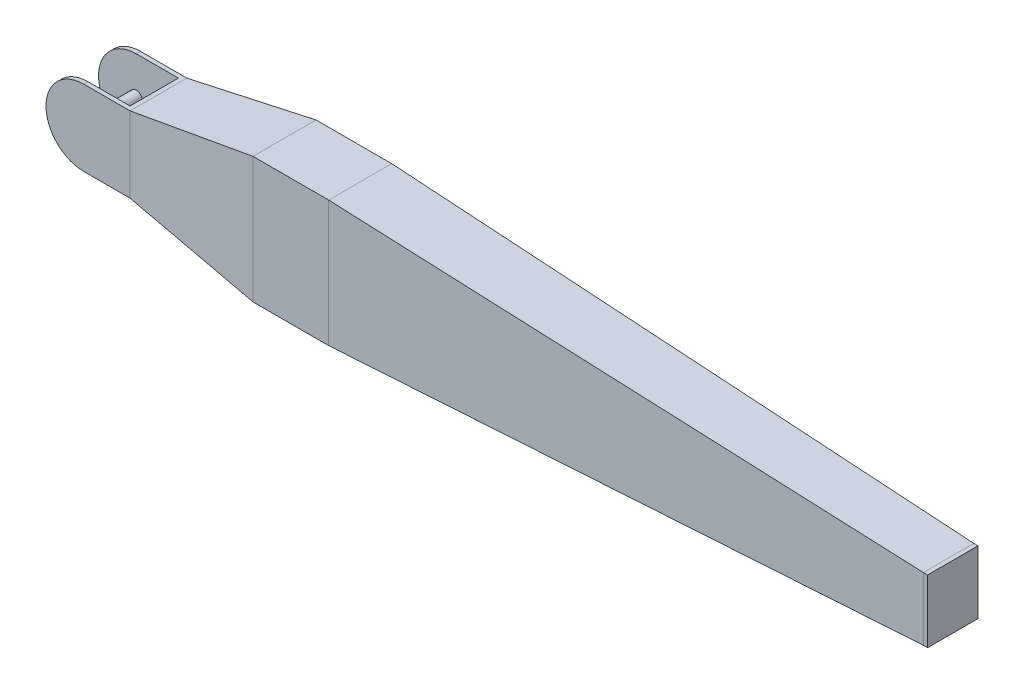
ISO-10303-21;
HEADER;
FILE_DESCRIPTION(('STEP AP214'),'2;1');
FILE_NAME('part.step','',(''),(''),'','','');
FILE_SCHEMA(('AUTOMOTIVE_DESIGN { 1 0 10303 214 1 1 1 1 }'));
ENDSEC;
DATA;
#1=APPLICATION_CONTEXT('core data for automotive mechanical design processes');
#2=APPLICATION_PROTOCOL_DEFINITION('international standard','automotive_design',2000,#1);
#3=PRODUCT_CONTEXT('',#1,'mechanical');
#4=PRODUCT('Part','Part','',(#3));
#5=PRODUCT_RELATED_PRODUCT_CATEGORY('part','',(#4));
#6=PRODUCT_DEFINITION_FORMATION('','',#4);
#7=PRODUCT_DEFINITION_CONTEXT('part definition',#1,'design');
#8=PRODUCT_DEFINITION('design','',#6,#7);
#9=PRODUCT_DEFINITION_SHAPE('','',#8);
#10=(LENGTH_UNIT() NAMED_UNIT(*) SI_UNIT(.MILLI.,.METRE.));
#11=(NAMED_UNIT(*) PLANE_ANGLE_UNIT() SI_UNIT($,.RADIAN.));
#12=(NAMED_UNIT(*) SI_UNIT($,.STERADIAN.) SOLID_ANGLE_UNIT());
#13=UNCERTAINTY_MEASURE_WITH_UNIT(LENGTH_MEASURE(1.E-05),#10,'distance_accuracy_value','');
#14=(GEOMETRIC_REPRESENTATION_CONTEXT(3) GLOBAL_UNCERTAINTY_ASSIGNED_CONTEXT((#13)) GLOBAL_UNIT_ASSIGNED_CONTEXT((#10,
#11,#12)) REPRESENTATION_CONTEXT('',''));
#15=CARTESIAN_POINT('',(0.,0.,0.));
#16=DIRECTION('',(0.,0.,1.));
#17=DIRECTION('',(1.,0.,0.));
#18=AXIS2_PLACEMENT_3D('',#15,#16,#17);
#19=CARTESIAN_POINT('',(-400.,0.,0.));
#20=DIRECTION('',(1.,0.,0.));
#21=DIRECTION('',(0.,1.,0.));
#22=AXIS2_PLACEMENT_3D('',#19,#20,#21);
#23=PLANE('',#22);
#24=DIRECTION('',(0.,0.,-1.));
#25=VECTOR('',#24,1.);
#26=CARTESIAN_POINT('',(-400.,90.,0.));
#27=LINE('',#26,#25);
#28=CARTESIAN_POINT('',(-400.,90.,57.5));
#29=VERTEX_POINT('',#28);
#30=CARTESIAN_POINT('',(-400.,90.,-57.5));
#31=VERTEX_POINT('',#30);
#32=EDGE_CURVE('E334',#29,#31,#27,.T.);
#33=ORIENTED_EDGE('',*,*,#32,.T.);
#34=DIRECTION('',(0.,-1.,0.));
#35=VECTOR('',#34,1.);
#36=CARTESIAN_POINT('',(-400.,0.,-57.5));
#37=LINE('',#36,#35);
#38=CARTESIAN_POINT('',(-400.,-90.,-57.5));
#39=VERTEX_POINT('',#38);
#40=EDGE_CURVE('E302',#31,#39,#37,.T.);
#41=ORIENTED_EDGE('',*,*,#40,.T.);
#42=DIRECTION('',(0.,0.,-1.));
#43=VECTOR('',#42,1.);
#44=CARTESIAN_POINT('',(-400.,-90.,0.));
#45=LINE('',#44,#43);
#46=CARTESIAN_POINT('',(-400.,-90.,57.5));
#47=VERTEX_POINT('',#46);
#48=EDGE_CURVE('E278',#47,#39,#45,.T.);
#49=ORIENTED_EDGE('',*,*,#48,.F.);
#50=DIRECTION('',(0.,-1.,0.));
#51=VECTOR('',#50,1.);
#52=CARTESIAN_POINT('',(-400.,0.,57.5));
#53=LINE('',#52,#51);
#54=EDGE_CURVE('E49',#29,#47,#53,.T.);
#55=ORIENTED_EDGE('',*,*,#54,.F.);
#56=EDGE_LOOP('',(#33,#41,#49,#55));
#57=FACE_BOUND('',#56,.T.);
#58=ADVANCED_FACE('F16',(#57),#23,.F.);
#59=CARTESIAN_POINT('',(60.,-2.5,70.));
#60=DIRECTION('',(0.,0.,1.));
#61=DIRECTION('',(1.,0.,0.));
#62=AXIS2_PLACEMENT_3D('',#59,#60,#61);
#63=PLANE('',#62);
#64=CARTESIAN_POINT('',(0.,-130.,70.));
#65=DIRECTION('',(0.,0.,1.));
#66=DIRECTION('',(1.,0.,0.));
#67=AXIS2_PLACEMENT_3D('',#64,#65,#66);
#68=CIRCLE('',#67,15.);
#69=CARTESIAN_POINT('',(15.,-130.,70.));
#70=VERTEX_POINT('',#69);
#71=EDGE_CURVE('E25',#70,#70,#68,.F.);
#72=ORIENTED_EDGE('',*,*,#71,.F.);
#73=EDGE_LOOP('',(#72));
#74=FACE_BOUND('',#73,.T.);
#75=DIRECTION('',(0.,1.,0.));
#76=VECTOR('',#75,1.);
#77=CARTESIAN_POINT('',(-60.,-2.5,70.));
#78=LINE('',#77,#76);
#79=CARTESIAN_POINT('',(-60.,-150.,70.));
#80=VERTEX_POINT('',#79);
#81=CARTESIAN_POINT('',(-60.,-145.,70.));
#82=VERTEX_POINT('',#81);
#83=EDGE_CURVE('E596',#80,#82,#78,.T.);
#84=ORIENTED_EDGE('',*,*,#83,.T.);
#85=DIRECTION('',(1.,0.,0.));
#86=VECTOR('',#85,1.);
#87=CARTESIAN_POINT('',(-90.,-145.,70.));
#88=LINE('',#87,#86);
#89=CARTESIAN_POINT('',(-90.,-145.,70.));
#90=VERTEX_POINT('',#89);
#91=EDGE_CURVE('E582',#90,#82,#88,.T.);
#92=ORIENTED_EDGE('',*,*,#91,.F.);
#93=DIRECTION('',(0.,-1.,0.));
#94=VECTOR('',#93,1.);
#95=CARTESIAN_POINT('',(-90.,0.,70.));
#96=LINE('',#95,#94);
#97=CARTESIAN_POINT('',(-90.,145.,70.));
#98=VERTEX_POINT('',#97);
#99=EDGE_CURVE('E567',#98,#90,#96,.T.);
#100=ORIENTED_EDGE('',*,*,#99,.F.);
#101=DIRECTION('',(-1.,0.,0.));
#102=VECTOR('',#101,1.);
#103=CARTESIAN_POINT('',(60.,145.,70.));
#104=LINE('',#103,#102);
#105=CARTESIAN_POINT('',(90.,145.,70.));
#106=VERTEX_POINT('',#105);
#107=EDGE_CURVE('E630',#106,#98,#104,.T.);
#108=ORIENTED_EDGE('',*,*,#107,.F.);
#109=DIRECTION('',(0.,-1.,0.));
#110=VECTOR('',#109,1.);
#111=CARTESIAN_POINT('',(90.,0.,70.));
#112=LINE('',#111,#110);
#113=CARTESIAN_POINT('',(90.,-145.,70.));
#114=VERTEX_POINT('',#113);
#115=EDGE_CURVE('E523',#106,#114,#112,.T.);
#116=ORIENTED_EDGE('',*,*,#115,.T.);
#117=DIRECTION('',(-1.,0.,0.));
#118=VECTOR('',#117,1.);
#119=CARTESIAN_POINT('',(90.,-145.,70.));
#120=LINE('',#119,#118);
#121=CARTESIAN_POINT('',(60.,-145.,70.));
#122=VERTEX_POINT('',#121);
#123=EDGE_CURVE('E538',#114,#122,#120,.T.);
#124=ORIENTED_EDGE('',*,*,#123,.T.);
#125=DIRECTION('',(0.,1.,0.));
#126=VECTOR('',#125,1.);
#127=CARTESIAN_POINT('',(60.,-2.5,70.));
#128=LINE('',#127,#126);
#129=CARTESIAN_POINT('',(60.,-150.,70.));
#130=VERTEX_POINT('',#129);
#131=EDGE_CURVE('E597',#130,#122,#128,.T.);
#132=ORIENTED_EDGE('',*,*,#131,.F.);
#133=DIRECTION('',(-1.,0.,0.));
#134=VECTOR('',#133,1.);
#135=CARTESIAN_POINT('',(60.,-150.,70.));
#136=LINE('',#135,#134);
#137=EDGE_CURVE('E605',#130,#80,#136,.T.);
#138=ORIENTED_EDGE('',*,*,#137,.T.);
#139=EDGE_LOOP('',(#84,#92,#100,#108,#116,#124,#132,#138));
#140=FACE_BOUND('',#139,.T.);
#141=ADVANCED_FACE('F647',(#74,#140),#63,.F.);
#142=CARTESIAN_POINT('',(60.,145.,0.));
#143=DIRECTION('',(0.,1.,0.));
#144=DIRECTION('',(0.,0.,1.));
#145=AXIS2_PLACEMENT_3D('',#142,#143,#144);
#146=PLANE('',#145);
#147=ORIENTED_EDGE('',*,*,#107,.T.);
#148=DIRECTION('',(0.,0.,-1.));
#149=VECTOR('',#148,1.);
#150=CARTESIAN_POINT('',(-90.,145.,0.));
#151=LINE('',#150,#149);
#152=CARTESIAN_POINT('',(-90.,145.,-70.));
#153=VERTEX_POINT('',#152);
#154=EDGE_CURVE('E570',#98,#153,#151,.T.);
#155=ORIENTED_EDGE('',*,*,#154,.T.);
#156=DIRECTION('',(-1.,0.,0.));
#157=VECTOR('',#156,1.);
#158=CARTESIAN_POINT('',(60.,145.,-70.));
#159=LINE('',#158,#157);
#160=CARTESIAN_POINT('',(90.,145.,-70.));
#161=VERTEX_POINT('',#160);
#162=EDGE_CURVE('E626',#161,#153,#159,.T.);
#163=ORIENTED_EDGE('',*,*,#162,.F.);
#164=DIRECTION('',(0.,0.,-1.));
#165=VECTOR('',#164,1.);
#166=CARTESIAN_POINT('',(90.,145.,0.));
#167=LINE('',#166,#165);
#168=EDGE_CURVE('E527',#106,#161,#167,.T.);
#169=ORIENTED_EDGE('',*,*,#168,.F.);
#170=EDGE_LOOP('',(#147,#155,#163,#169));
#171=FACE_BOUND('',#170,.T.);
#172=ADVANCED_FACE('F650',(#171),#146,.F.);
#173=CARTESIAN_POINT('',(60.,-2.50000000000005,-70.));
#174=DIRECTION('',(0.,0.,1.));
#175=DIRECTION('',(1.,0.,0.));
#176=AXIS2_PLACEMENT_3D('',#173,#174,#175);
#177=PLANE('',#176);
#178=CARTESIAN_POINT('',(0.,-130.,-70.));
#179=DIRECTION('',(0.,0.,1.));
#180=DIRECTION('',(1.,0.,0.));
#181=AXIS2_PLACEMENT_3D('',#178,#179,#180);
#182=CIRCLE('',#181,15.);
#183=CARTESIAN_POINT('',(15.,-130.,-70.));
#184=VERTEX_POINT('',#183);
#185=EDGE_CURVE('E502',#184,#184,#182,.T.);
#186=ORIENTED_EDGE('',*,*,#185,.F.);
#187=EDGE_LOOP('',(#186));
#188=FACE_BOUND('',#187,.T.);
#189=DIRECTION('',(0.,1.,0.));
#190=VECTOR('',#189,1.);
#191=CARTESIAN_POINT('',(-60.,-2.50000000000005,-70.));
#192=LINE('',#191,#190);
#193=CARTESIAN_POINT('',(-60.,-150.,-70.));
#194=VERTEX_POINT('',#193);
#195=CARTESIAN_POINT('',(-60.,-145.,-70.));
#196=VERTEX_POINT('',#195);
#197=EDGE_CURVE('E601',#194,#196,#192,.T.);
#198=ORIENTED_EDGE('',*,*,#197,.F.);
#199=DIRECTION('',(-1.,0.,0.));
#200=VECTOR('',#199,1.);
#201=CARTESIAN_POINT('',(60.,-150.,-70.));
#202=LINE('',#201,#200);
#203=CARTESIAN_POINT('',(60.,-150.,-70.));
#204=VERTEX_POINT('',#203);
#205=EDGE_CURVE('E623',#204,#194,#202,.T.);
#206=ORIENTED_EDGE('',*,*,#205,.F.);
#207=DIRECTION('',(0.,1.,0.));
#208=VECTOR('',#207,1.);
#209=CARTESIAN_POINT('',(60.,-2.50000000000005,-70.));
#210=LINE('',#209,#208);
#211=CARTESIAN_POINT('',(60.,-145.,-70.));
#212=VERTEX_POINT('',#211);
#213=EDGE_CURVE('E600',#204,#212,#210,.T.);
#214=ORIENTED_EDGE('',*,*,#213,.T.);
#215=DIRECTION('',(-1.,0.,0.));
#216=VECTOR('',#215,1.);
#217=CARTESIAN_POINT('',(90.,-145.,-70.));
#218=LINE('',#217,#216);
#219=CARTESIAN_POINT('',(90.,-145.,-70.));
#220=VERTEX_POINT('',#219);
#221=EDGE_CURVE('E548',#220,#212,#218,.T.);
#222=ORIENTED_EDGE('',*,*,#221,.F.);
#223=DIRECTION('',(0.,-1.,0.));
#224=VECTOR('',#223,1.);
#225=CARTESIAN_POINT('',(90.,0.,-70.));
#226=LINE('',#225,#224);
#227=EDGE_CURVE('E530',#161,#220,#226,.T.);
#228=ORIENTED_EDGE('',*,*,#227,.F.);
#229=ORIENTED_EDGE('',*,*,#162,.T.);
#230=DIRECTION('',(0.,-1.,0.));
#231=VECTOR('',#230,1.);
#232=CARTESIAN_POINT('',(-90.,0.,-70.));
#233=LINE('',#232,#231);
#234=CARTESIAN_POINT('',(-90.,-145.,-70.));
#235=VERTEX_POINT('',#234);
#236=EDGE_CURVE('E574',#153,#235,#233,.T.);
#237=ORIENTED_EDGE('',*,*,#236,.T.);
#238=DIRECTION('',(1.,0.,0.));
#239=VECTOR('',#238,1.);
#240=CARTESIAN_POINT('',(-90.,-145.,-70.));
#241=LINE('',#240,#239);
#242=EDGE_CURVE('E592',#235,#196,#241,.T.);
#243=ORIENTED_EDGE('',*,*,#242,.T.);
#244=EDGE_LOOP('',(#198,#206,#214,#222,#228,#229,#237,#243));
#245=FACE_BOUND('',#244,.T.);
#246=ADVANCED_FACE('F667',(#188,#245),#177,.T.);
#247=CARTESIAN_POINT('',(60.,-150.,-72.5));
#248=DIRECTION('',(0.,-1.,0.));
#249=DIRECTION('',(0.,0.,-1.));
#250=AXIS2_PLACEMENT_3D('',#247,#248,#249);
#251=PLANE('',#250);
#252=DIRECTION('',(0.,0.,-1.));
#253=VECTOR('',#252,1.);
#254=CARTESIAN_POINT('',(60.,-150.,0.));
#255=LINE('',#254,#253);
#256=EDGE_CURVE('E506',#130,#204,#255,.T.);
#257=ORIENTED_EDGE('',*,*,#256,.T.);
#258=ORIENTED_EDGE('',*,*,#205,.T.);
#259=DIRECTION('',(0.,0.,-1.));
#260=VECTOR('',#259,1.);
#261=CARTESIAN_POINT('',(-60.,-150.,0.));
#262=LINE('',#261,#260);
#263=EDGE_CURVE('E551',#80,#194,#262,.T.);
#264=ORIENTED_EDGE('',*,*,#263,.F.);
#265=ORIENTED_EDGE('',*,*,#137,.F.);
#266=EDGE_LOOP('',(#257,#258,#264,#265));
#267=FACE_BOUND('',#266,.T.);
#268=DIRECTION('',(-1.,0.,0.));
#269=VECTOR('',#268,1.);
#270=CARTESIAN_POINT('',(60.,-150.,-75.));
#271=LINE('',#270,#269);
#272=CARTESIAN_POINT('',(90.,-150.,-75.));
#273=VERTEX_POINT('',#272);
#274=CARTESIAN_POINT('',(-90.,-150.,-75.));
#275=VERTEX_POINT('',#274);
#276=EDGE_CURVE('E614',#273,#275,#271,.T.);
#277=ORIENTED_EDGE('',*,*,#276,.F.);
#278=DIRECTION('',(0.,0.,-1.));
#279=VECTOR('',#278,1.);
#280=CARTESIAN_POINT('',(90.,-150.,0.));
#281=LINE('',#280,#279);
#282=CARTESIAN_POINT('',(90.,-150.,75.));
#283=VERTEX_POINT('',#282);
#284=EDGE_CURVE('E515',#283,#273,#281,.T.);
#285=ORIENTED_EDGE('',*,*,#284,.F.);
#286=DIRECTION('',(-1.,0.,0.));
#287=VECTOR('',#286,1.);
#288=CARTESIAN_POINT('',(60.,-150.,75.));
#289=LINE('',#288,#287);
#290=CARTESIAN_POINT('',(-90.,-150.,75.));
#291=VERTEX_POINT('',#290);
#292=EDGE_CURVE('E619',#283,#291,#289,.T.);
#293=ORIENTED_EDGE('',*,*,#292,.T.);
#294=DIRECTION('',(0.,0.,-1.));
#295=VECTOR('',#294,1.);
#296=CARTESIAN_POINT('',(-90.,-150.,0.));
#297=LINE('',#296,#295);
#298=EDGE_CURVE('E560',#291,#275,#297,.T.);
#299=ORIENTED_EDGE('',*,*,#298,.T.);
#300=EDGE_LOOP('',(#277,#285,#293,#299));
#301=FACE_BOUND('',#300,.T.);
#302=ADVANCED_FACE('F813',(#267,#301),#251,.T.);
#303=CARTESIAN_POINT('',(60.,-2.5,-75.));
#304=DIRECTION('',(0.,0.,1.));
#305=DIRECTION('',(1.,0.,0.));
#306=AXIS2_PLACEMENT_3D('',#303,#304,#305);
#307=PLANE('',#306);
#308=ORIENTED_EDGE('',*,*,#276,.T.);
#309=DIRECTION('',(0.,-1.,0.));
#310=VECTOR('',#309,1.);
#311=CARTESIAN_POINT('',(-90.,0.,-75.));
#312=LINE('',#311,#310);
#313=CARTESIAN_POINT('',(-90.,150.,-75.));
#314=VERTEX_POINT('',#313);
#315=EDGE_CURVE('E564',#314,#275,#312,.T.);
#316=ORIENTED_EDGE('',*,*,#315,.F.);
#317=DIRECTION('',(-1.,0.,0.));
#318=VECTOR('',#317,1.);
#319=CARTESIAN_POINT('',(60.,150.,-75.));
#320=LINE('',#319,#318);
#321=CARTESIAN_POINT('',(90.,150.,-75.));
#322=VERTEX_POINT('',#321);
#323=EDGE_CURVE('E610',#322,#314,#320,.T.);
#324=ORIENTED_EDGE('',*,*,#323,.F.);
#325=DIRECTION('',(0.,-1.,0.));
#326=VECTOR('',#325,1.);
#327=CARTESIAN_POINT('',(90.,0.,-75.));
#328=LINE('',#327,#326);
#329=EDGE_CURVE('E519',#322,#273,#328,.T.);
#330=ORIENTED_EDGE('',*,*,#329,.T.);
#331=EDGE_LOOP('',(#308,#316,#324,#330));
#332=FACE_BOUND('',#331,.T.);
#333=ADVANCED_FACE('F809',(#332),#307,.F.);
#334=CARTESIAN_POINT('',(60.,150.,0.));
#335=DIRECTION('',(0.,1.,0.));
#336=DIRECTION('',(0.,0.,1.));
#337=AXIS2_PLACEMENT_3D('',#334,#335,#336);
#338=PLANE('',#337);
#339=ORIENTED_EDGE('',*,*,#323,.T.);
#340=DIRECTION('',(0.,0.,-1.));
#341=VECTOR('',#340,1.);
#342=CARTESIAN_POINT('',(-90.,150.,0.));
#343=LINE('',#342,#341);
#344=CARTESIAN_POINT('',(-90.,150.,75.));
#345=VERTEX_POINT('',#344);
#346=EDGE_CURVE('E552',#345,#314,#343,.T.);
#347=ORIENTED_EDGE('',*,*,#346,.F.);
#348=DIRECTION('',(-1.,0.,0.));
#349=VECTOR('',#348,1.);
#350=CARTESIAN_POINT('',(60.,150.,75.));
#351=LINE('',#350,#349);
#352=CARTESIAN_POINT('',(90.,150.,75.));
#353=VERTEX_POINT('',#352);
#354=EDGE_CURVE('E615',#353,#345,#351,.T.);
#355=ORIENTED_EDGE('',*,*,#354,.F.);
#356=DIRECTION('',(0.,0.,-1.));
#357=VECTOR('',#356,1.);
#358=CARTESIAN_POINT('',(90.,150.,0.));
#359=LINE('',#358,#357);
#360=EDGE_CURVE('E507',#353,#322,#359,.T.);
#361=ORIENTED_EDGE('',*,*,#360,.T.);
#362=EDGE_LOOP('',(#339,#347,#355,#361));
#363=FACE_BOUND('',#362,.T.);
#364=ADVANCED_FACE('F806',(#363),#338,.T.);
#365=CARTESIAN_POINT('',(60.,-2.50000000000005,75.));
#366=DIRECTION('',(0.,0.,1.));
#367=DIRECTION('',(1.,0.,0.));
#368=AXIS2_PLACEMENT_3D('',#365,#366,#367);
#369=PLANE('',#368);
#370=ORIENTED_EDGE('',*,*,#354,.T.);
#371=DIRECTION('',(0.,-1.,0.));
#372=VECTOR('',#371,1.);
#373=CARTESIAN_POINT('',(-90.,0.,75.));
#374=LINE('',#373,#372);
#375=EDGE_CURVE('E555',#345,#291,#374,.T.);
#376=ORIENTED_EDGE('',*,*,#375,.T.);
#377=ORIENTED_EDGE('',*,*,#292,.F.);
#378=DIRECTION('',(0.,-1.,0.));
#379=VECTOR('',#378,1.);
#380=CARTESIAN_POINT('',(90.,0.,75.));
#381=LINE('',#380,#379);
#382=EDGE_CURVE('E511',#353,#283,#381,.T.);
#383=ORIENTED_EDGE('',*,*,#382,.F.);
#384=EDGE_LOOP('',(#370,#376,#377,#383));
#385=FACE_BOUND('',#384,.T.);
#386=ADVANCED_FACE('F18',(#385),#369,.T.);
#387=CARTESIAN_POINT('',(-60.,0.,0.));
#388=DIRECTION('',(1.,0.,0.));
#389=DIRECTION('',(0.,1.,0.));
#390=AXIS2_PLACEMENT_3D('',#387,#388,#389);
#391=PLANE('',#390);
#392=ORIENTED_EDGE('',*,*,#83,.F.);
#393=ORIENTED_EDGE('',*,*,#263,.T.);
#394=ORIENTED_EDGE('',*,*,#197,.T.);
#395=DIRECTION('',(0.,0.,-1.));
#396=VECTOR('',#395,1.);
#397=CARTESIAN_POINT('',(-60.,-145.,0.));
#398=LINE('',#397,#396);
#399=EDGE_CURVE('E556',#82,#196,#398,.T.);
#400=ORIENTED_EDGE('',*,*,#399,.F.);
#401=EDGE_LOOP('',(#392,#393,#394,#400));
#402=FACE_BOUND('',#401,.T.);
#403=ADVANCED_FACE('F663',(#402),#391,.T.);
#404=CARTESIAN_POINT('',(-90.,-145.,0.));
#405=DIRECTION('',(0.,-1.,0.));
#406=DIRECTION('',(0.,0.,-1.));
#407=AXIS2_PLACEMENT_3D('',#404,#405,#406);
#408=PLANE('',#407);
#409=ORIENTED_EDGE('',*,*,#399,.T.);
#410=ORIENTED_EDGE('',*,*,#242,.F.);
#411=DIRECTION('',(0.,0.,-1.));
#412=VECTOR('',#411,1.);
#413=CARTESIAN_POINT('',(-90.,-145.,0.));
#414=LINE('',#413,#412);
#415=EDGE_CURVE('E578',#90,#235,#414,.T.);
#416=ORIENTED_EDGE('',*,*,#415,.F.);
#417=ORIENTED_EDGE('',*,*,#91,.T.);
#418=EDGE_LOOP('',(#409,#410,#416,#417));
#419=FACE_BOUND('',#418,.T.);
#420=ADVANCED_FACE('F661',(#419),#408,.F.);
#421=CARTESIAN_POINT('',(60.,0.,0.));
#422=DIRECTION('',(1.,0.,0.));
#423=DIRECTION('',(0.,1.,0.));
#424=AXIS2_PLACEMENT_3D('',#421,#422,#423);
#425=PLANE('',#424);
#426=ORIENTED_EDGE('',*,*,#256,.F.);
#427=ORIENTED_EDGE('',*,*,#131,.T.);
#428=DIRECTION('',(0.,0.,-1.));
#429=VECTOR('',#428,1.);
#430=CARTESIAN_POINT('',(60.,-145.,0.));
#431=LINE('',#430,#429);
#432=EDGE_CURVE('E512',#122,#212,#431,.T.);
#433=ORIENTED_EDGE('',*,*,#432,.T.);
#434=ORIENTED_EDGE('',*,*,#213,.F.);
#435=EDGE_LOOP('',(#426,#427,#433,#434));
#436=FACE_BOUND('',#435,.T.);
#437=ADVANCED_FACE('F792',(#436),#425,.F.);
#438=CARTESIAN_POINT('',(90.,-145.,0.));
#439=DIRECTION('',(0.,1.,0.));
#440=DIRECTION('',(0.,0.,1.));
#441=AXIS2_PLACEMENT_3D('',#438,#439,#440);
#442=PLANE('',#441);
#443=ORIENTED_EDGE('',*,*,#432,.F.);
#444=ORIENTED_EDGE('',*,*,#123,.F.);
#445=DIRECTION('',(0.,0.,-1.));
#446=VECTOR('',#445,1.);
#447=CARTESIAN_POINT('',(90.,-145.,0.));
#448=LINE('',#447,#446);
#449=EDGE_CURVE('E534',#114,#220,#448,.T.);
#450=ORIENTED_EDGE('',*,*,#449,.T.);
#451=ORIENTED_EDGE('',*,*,#221,.T.);
#452=EDGE_LOOP('',(#443,#444,#450,#451));
#453=FACE_BOUND('',#452,.T.);
#454=ADVANCED_FACE('F791',(#453),#442,.T.);
#455=CARTESIAN_POINT('',(0.,-130.,70.));
#456=DIRECTION('',(0.,0.,-1.));
#457=DIRECTION('',(-1.,0.,0.));
#458=AXIS2_PLACEMENT_3D('',#455,#456,#457);
#459=CYLINDRICAL_SURFACE('',#458,15.);
#460=ORIENTED_EDGE('',*,*,#71,.T.);
#461=EDGE_LOOP('',(#460));
#462=FACE_BOUND('',#461,.T.);
#463=ORIENTED_EDGE('',*,*,#185,.T.);
#464=EDGE_LOOP('',(#463));
#465=FACE_BOUND('',#464,.T.);
#466=ADVANCED_FACE('F644',(#462,#465),#459,.T.);
#467=CARTESIAN_POINT('',(0.813809639199582,0.,75.9555663252943));
#468=DIRECTION('',(0.0107136707890943,0.,0.999942606982132));
#469=DIRECTION('',(0.999942606982132,0.,-0.0107136707890943));
#470=AXIS2_PLACEMENT_3D('',#467,#468,#469);
#471=PLANE('',#470);
#472=DIRECTION('',(0.998510985422932,0.0534916599333713,-0.0106983319866743));
#473=VECTOR('',#472,1.);
#474=CARTESIAN_POINT('',(90.,-150.,75.));
#475=LINE('',#474,#473);
#476=CARTESIAN_POINT('',(1490.,-75.,60.));
#477=VERTEX_POINT('',#476);
#478=EDGE_CURVE('E476',#283,#477,#475,.T.);
#479=ORIENTED_EDGE('',*,*,#478,.T.);
#480=DIRECTION('',(0.,-1.,0.));
#481=VECTOR('',#480,1.);
#482=CARTESIAN_POINT('',(1490.,0.,60.));
#483=LINE('',#482,#481);
#484=CARTESIAN_POINT('',(1490.,75.,60.));
#485=VERTEX_POINT('',#484);
#486=EDGE_CURVE('E472',#485,#477,#483,.T.);
#487=ORIENTED_EDGE('',*,*,#486,.F.);
#488=DIRECTION('',(0.998510985422932,-0.0534916599333713,-0.0106983319866743));
#489=VECTOR('',#488,1.);
#490=CARTESIAN_POINT('',(90.,150.,75.));
#491=LINE('',#490,#489);
#492=EDGE_CURVE('E471',#353,#485,#491,.T.);
#493=ORIENTED_EDGE('',*,*,#492,.F.);
#494=ORIENTED_EDGE('',*,*,#382,.T.);
#495=EDGE_LOOP('',(#479,#487,#493,#494));
#496=FACE_BOUND('',#495,.T.);
#497=ADVANCED_FACE('F778',(#496),#471,.T.);
#498=CARTESIAN_POINT('',(8.27027027027026,-154.378378378378,0.));
#499=DIRECTION('',(0.0534947213716119,-0.998568132270089,0.));
#500=DIRECTION('',(0.998568132270089,0.0534947213716119,0.));
#501=AXIS2_PLACEMENT_3D('',#498,#499,#500);
#502=PLANE('',#501);
#503=DIRECTION('',(0.998510985422932,0.0534916599333713,0.0106983319866743));
#504=VECTOR('',#503,1.);
#505=CARTESIAN_POINT('',(90.,-150.,-75.));
#506=LINE('',#505,#504);
#507=CARTESIAN_POINT('',(1490.,-75.,-60.));
#508=VERTEX_POINT('',#507);
#509=EDGE_CURVE('E487',#273,#508,#506,.T.);
#510=ORIENTED_EDGE('',*,*,#509,.T.);
#511=DIRECTION('',(0.,0.,-1.));
#512=VECTOR('',#511,1.);
#513=CARTESIAN_POINT('',(1490.,-75.,0.));
#514=LINE('',#513,#512);
#515=EDGE_CURVE('E480',#477,#508,#514,.T.);
#516=ORIENTED_EDGE('',*,*,#515,.F.);
#517=ORIENTED_EDGE('',*,*,#478,.F.);
#518=ORIENTED_EDGE('',*,*,#284,.T.);
#519=EDGE_LOOP('',(#510,#516,#517,#518));
#520=FACE_BOUND('',#519,.T.);
#521=ADVANCED_FACE('F781',(#520),#502,.T.);
#522=CARTESIAN_POINT('',(0.81380963919958,0.,-75.9555663252943));
#523=DIRECTION('',(-0.0107136707890943,0.,0.999942606982132));
#524=DIRECTION('',(0.999942606982132,0.,0.0107136707890943));
#525=AXIS2_PLACEMENT_3D('',#522,#523,#524);
#526=PLANE('',#525);
#527=DIRECTION('',(0.998510985422932,-0.0534916599333714,0.0106983319866743));
#528=VECTOR('',#527,1.);
#529=CARTESIAN_POINT('',(90.,150.,-75.));
#530=LINE('',#529,#528);
#531=CARTESIAN_POINT('',(1490.,75.,-60.));
#532=VERTEX_POINT('',#531);
#533=EDGE_CURVE('E494',#322,#532,#530,.T.);
#534=ORIENTED_EDGE('',*,*,#533,.T.);
#535=DIRECTION('',(0.,-1.,0.));
#536=VECTOR('',#535,1.);
#537=CARTESIAN_POINT('',(1490.,0.,-60.));
#538=LINE('',#537,#536);
#539=EDGE_CURVE('E490',#508,#532,#538,.F.);
#540=ORIENTED_EDGE('',*,*,#539,.F.);
#541=ORIENTED_EDGE('',*,*,#509,.F.);
#542=ORIENTED_EDGE('',*,*,#329,.F.);
#543=EDGE_LOOP('',(#534,#540,#541,#542));
#544=FACE_BOUND('',#543,.T.);
#545=ADVANCED_FACE('F766',(#544),#526,.F.);
#546=CARTESIAN_POINT('',(8.27027027027027,154.378378378378,0.));
#547=DIRECTION('',(-0.0534947213716119,-0.998568132270089,0.));
#548=DIRECTION('',(0.998568132270089,-0.0534947213716119,0.));
#549=AXIS2_PLACEMENT_3D('',#546,#547,#548);
#550=PLANE('',#549);
#551=DIRECTION('',(0.,0.,-1.));
#552=VECTOR('',#551,1.);
#553=CARTESIAN_POINT('',(1490.,75.,0.));
#554=LINE('',#553,#552);
#555=EDGE_CURVE('E498',#532,#485,#554,.F.);
#556=ORIENTED_EDGE('',*,*,#555,.F.);
#557=ORIENTED_EDGE('',*,*,#533,.F.);
#558=ORIENTED_EDGE('',*,*,#360,.F.);
#559=ORIENTED_EDGE('',*,*,#492,.T.);
#560=EDGE_LOOP('',(#556,#557,#558,#559));
#561=FACE_BOUND('',#560,.T.);
#562=ADVANCED_FACE('F757',(#561),#550,.F.);
#563=CARTESIAN_POINT('',(0.760244359703607,0.,70.9561402390032));
#564=DIRECTION('',(0.0107136707890943,0.,0.999942606982132));
#565=DIRECTION('',(0.999942606982132,0.,-0.0107136707890943));
#566=AXIS2_PLACEMENT_3D('',#563,#564,#565);
#567=PLANE('',#566);
#568=DIRECTION('',(0.998510985422932,0.0534916599333714,-0.0106983319866743));
#569=VECTOR('',#568,1.);
#570=CARTESIAN_POINT('',(90.,-145.,70.));
#571=LINE('',#570,#569);
#572=CARTESIAN_POINT('',(1490.,-70.,55.));
#573=VERTEX_POINT('',#572);
#574=EDGE_CURVE('E444',#114,#573,#571,.T.);
#575=ORIENTED_EDGE('',*,*,#574,.F.);
#576=ORIENTED_EDGE('',*,*,#115,.F.);
#577=DIRECTION('',(0.998510985422932,-0.0534916599333713,-0.0106983319866743));
#578=VECTOR('',#577,1.);
#579=CARTESIAN_POINT('',(90.,145.,70.));
#580=LINE('',#579,#578);
#581=CARTESIAN_POINT('',(1490.,70.,55.));
#582=VERTEX_POINT('',#581);
#583=EDGE_CURVE('E439',#106,#582,#580,.T.);
#584=ORIENTED_EDGE('',*,*,#583,.T.);
#585=DIRECTION('',(0.,-1.,0.));
#586=VECTOR('',#585,1.);
#587=CARTESIAN_POINT('',(1490.,0.,55.));
#588=LINE('',#587,#586);
#589=EDGE_CURVE('E440',#582,#573,#588,.T.);
#590=ORIENTED_EDGE('',*,*,#589,.T.);
#591=EDGE_LOOP('',(#575,#576,#584,#590));
#592=FACE_BOUND('',#591,.T.);
#593=ADVANCED_FACE('F747',(#592),#567,.F.);
#594=CARTESIAN_POINT('',(8.00317965023848,-149.392686804451,0.));
#595=DIRECTION('',(0.0534947213716119,-0.998568132270089,0.));
#596=DIRECTION('',(0.998568132270089,0.0534947213716119,0.));
#597=AXIS2_PLACEMENT_3D('',#594,#595,#596);
#598=PLANE('',#597);
#599=DIRECTION('',(0.998510985422932,0.0534916599333714,0.0106983319866743));
#600=VECTOR('',#599,1.);
#601=CARTESIAN_POINT('',(90.,-145.,-70.));
#602=LINE('',#601,#600);
#603=CARTESIAN_POINT('',(1490.,-70.,-55.));
#604=VERTEX_POINT('',#603);
#605=EDGE_CURVE('E455',#220,#604,#602,.T.);
#606=ORIENTED_EDGE('',*,*,#605,.F.);
#607=ORIENTED_EDGE('',*,*,#449,.F.);
#608=ORIENTED_EDGE('',*,*,#574,.T.);
#609=DIRECTION('',(0.,0.,-1.));
#610=VECTOR('',#609,1.);
#611=CARTESIAN_POINT('',(1490.,-70.,0.));
#612=LINE('',#611,#610);
#613=EDGE_CURVE('E448',#573,#604,#612,.T.);
#614=ORIENTED_EDGE('',*,*,#613,.T.);
#615=EDGE_LOOP('',(#606,#607,#608,#614));
#616=FACE_BOUND('',#615,.T.);
#617=ADVANCED_FACE('F756',(#616),#598,.F.);
#618=CARTESIAN_POINT('',(0.760244359703606,0.,-70.9561402390032));
#619=DIRECTION('',(-0.0107136707890943,0.,0.999942606982132));
#620=DIRECTION('',(0.999942606982132,0.,0.0107136707890943));
#621=AXIS2_PLACEMENT_3D('',#618,#619,#620);
#622=PLANE('',#621);
#623=DIRECTION('',(0.998510985422932,-0.0534916599333713,0.0106983319866743));
#624=VECTOR('',#623,1.);
#625=CARTESIAN_POINT('',(90.,145.,-70.));
#626=LINE('',#625,#624);
#627=CARTESIAN_POINT('',(1490.,70.,-55.));
#628=VERTEX_POINT('',#627);
#629=EDGE_CURVE('E463',#161,#628,#626,.T.);
#630=ORIENTED_EDGE('',*,*,#629,.F.);
#631=ORIENTED_EDGE('',*,*,#227,.T.);
#632=ORIENTED_EDGE('',*,*,#605,.T.);
#633=DIRECTION('',(0.,-1.,0.));
#634=VECTOR('',#633,1.);
#635=CARTESIAN_POINT('',(1490.,0.,-55.));
#636=LINE('',#635,#634);
#637=EDGE_CURVE('E459',#604,#628,#636,.F.);
#638=ORIENTED_EDGE('',*,*,#637,.T.);
#639=EDGE_LOOP('',(#630,#631,#632,#638));
#640=FACE_BOUND('',#639,.T.);
#641=ADVANCED_FACE('F763',(#640),#622,.T.);
#642=CARTESIAN_POINT('',(8.00317965023847,149.392686804451,0.));
#643=DIRECTION('',(-0.0534947213716119,-0.998568132270089,0.));
#644=DIRECTION('',(0.998568132270089,-0.0534947213716119,0.));
#645=AXIS2_PLACEMENT_3D('',#642,#643,#644);
#646=PLANE('',#645);
#647=DIRECTION('',(0.,0.,-1.));
#648=VECTOR('',#647,1.);
#649=CARTESIAN_POINT('',(1490.,70.,0.));
#650=LINE('',#649,#648);
#651=EDGE_CURVE('E467',#628,#582,#650,.F.);
#652=ORIENTED_EDGE('',*,*,#651,.T.);
#653=ORIENTED_EDGE('',*,*,#583,.F.);
#654=ORIENTED_EDGE('',*,*,#168,.T.);
#655=ORIENTED_EDGE('',*,*,#629,.T.);
#656=EDGE_LOOP('',(#652,#653,#654,#655));
#657=FACE_BOUND('',#656,.T.);
#658=ADVANCED_FACE('F773',(#657),#646,.T.);
#659=CARTESIAN_POINT('',(-32.3076923076923,161.538461538462,0.));
#660=DIRECTION('',(-0.196116135138184,0.98058067569092,0.));
#661=DIRECTION('',(-0.98058067569092,-0.196116135138184,0.));
#662=AXIS2_PLACEMENT_3D('',#659,#660,#661);
#663=PLANE('',#662);
#664=DIRECTION('',(-0.980286162791744,-0.196057232558349,0.0245071540697935));
#665=VECTOR('',#664,1.);
#666=CARTESIAN_POINT('',(-90.,150.,-75.));
#667=LINE('',#666,#665);
#668=CARTESIAN_POINT('',(-390.,90.,-67.5));
#669=VERTEX_POINT('',#668);
#670=EDGE_CURVE('E414',#314,#669,#667,.T.);
#671=ORIENTED_EDGE('',*,*,#670,.T.);
#672=DIRECTION('',(0.,0.,-1.));
#673=VECTOR('',#672,1.);
#674=CARTESIAN_POINT('',(-390.,90.,0.));
#675=LINE('',#674,#673);
#676=CARTESIAN_POINT('',(-390.,90.,67.5));
#677=VERTEX_POINT('',#676);
#678=EDGE_CURVE('E273',#677,#669,#675,.T.);
#679=ORIENTED_EDGE('',*,*,#678,.F.);
#680=DIRECTION('',(-0.980286162791744,-0.196057232558349,-0.0245071540697936));
#681=VECTOR('',#680,1.);
#682=CARTESIAN_POINT('',(-90.,150.,75.));
#683=LINE('',#682,#681);
#684=EDGE_CURVE('E411',#345,#677,#683,.T.);
#685=ORIENTED_EDGE('',*,*,#684,.F.);
#686=ORIENTED_EDGE('',*,*,#346,.T.);
#687=EDGE_LOOP('',(#671,#679,#685,#686));
#688=FACE_BOUND('',#687,.T.);
#689=ADVANCED_FACE('F692',(#688),#663,.T.);
#690=CARTESIAN_POINT('',(-1.93004372267333,0.,-77.2017489069332));
#691=DIRECTION('',(-0.024992191160203,0.,-0.999687646408123));
#692=DIRECTION('',(-0.999687646408123,0.,0.024992191160203));
#693=AXIS2_PLACEMENT_3D('',#690,#691,#692);
#694=PLANE('',#693);
#695=DIRECTION('',(-0.980286162791744,0.196057232558349,0.0245071540697935));
#696=VECTOR('',#695,1.);
#697=CARTESIAN_POINT('',(-90.,-150.,-75.));
#698=LINE('',#697,#696);
#699=CARTESIAN_POINT('',(-390.,-90.,-67.5));
#700=VERTEX_POINT('',#699);
#701=EDGE_CURVE('E423',#275,#700,#698,.T.);
#702=ORIENTED_EDGE('',*,*,#701,.T.);
#703=DIRECTION('',(0.,-1.,0.));
#704=VECTOR('',#703,1.);
#705=CARTESIAN_POINT('',(-390.,0.,-67.5));
#706=LINE('',#705,#704);
#707=EDGE_CURVE('E417',#669,#700,#706,.T.);
#708=ORIENTED_EDGE('',*,*,#707,.F.);
#709=ORIENTED_EDGE('',*,*,#670,.F.);
#710=ORIENTED_EDGE('',*,*,#315,.T.);
#711=EDGE_LOOP('',(#702,#708,#709,#710));
#712=FACE_BOUND('',#711,.T.);
#713=ADVANCED_FACE('F751',(#712),#694,.T.);
#714=CARTESIAN_POINT('',(-32.3076923076923,-161.538461538462,0.));
#715=DIRECTION('',(0.196116135138184,0.98058067569092,0.));
#716=DIRECTION('',(-0.98058067569092,0.196116135138184,0.));
#717=AXIS2_PLACEMENT_3D('',#714,#715,#716);
#718=PLANE('',#717);
#719=DIRECTION('',(-0.980286162791744,0.196057232558349,-0.0245071540697935));
#720=VECTOR('',#719,1.);
#721=CARTESIAN_POINT('',(-90.,-150.,75.));
#722=LINE('',#721,#720);
#723=CARTESIAN_POINT('',(-390.,-90.,67.5));
#724=VERTEX_POINT('',#723);
#725=EDGE_CURVE('E431',#291,#724,#722,.T.);
#726=ORIENTED_EDGE('',*,*,#725,.T.);
#727=DIRECTION('',(0.,0.,-1.));
#728=VECTOR('',#727,1.);
#729=CARTESIAN_POINT('',(-390.,-90.,0.));
#730=LINE('',#729,#728);
#731=EDGE_CURVE('E427',#700,#724,#730,.F.);
#732=ORIENTED_EDGE('',*,*,#731,.F.);
#733=ORIENTED_EDGE('',*,*,#701,.F.);
#734=ORIENTED_EDGE('',*,*,#298,.F.);
#735=EDGE_LOOP('',(#726,#732,#733,#734));
#736=FACE_BOUND('',#735,.T.);
#737=ADVANCED_FACE('F744',(#736),#718,.F.);
#738=CARTESIAN_POINT('',(-1.93004372267333,0.,77.2017489069332));
#739=DIRECTION('',(0.024992191160203,0.,-0.999687646408123));
#740=DIRECTION('',(-0.999687646408123,0.,-0.024992191160203));
#741=AXIS2_PLACEMENT_3D('',#738,#739,#740);
#742=PLANE('',#741);
#743=DIRECTION('',(0.,-1.,0.));
#744=VECTOR('',#743,1.);
#745=CARTESIAN_POINT('',(-390.,0.,67.5));
#746=LINE('',#745,#744);
#747=EDGE_CURVE('E435',#724,#677,#746,.F.);
#748=ORIENTED_EDGE('',*,*,#747,.F.);
#749=ORIENTED_EDGE('',*,*,#725,.F.);
#750=ORIENTED_EDGE('',*,*,#375,.F.);
#751=ORIENTED_EDGE('',*,*,#684,.T.);
#752=EDGE_LOOP('',(#748,#749,#750,#751));
#753=FACE_BOUND('',#752,.T.);
#754=ADVANCED_FACE('F740',(#753),#742,.F.);
#755=CARTESIAN_POINT('',(-31.3461538461538,156.730769230769,0.));
#756=DIRECTION('',(-0.196116135138184,0.98058067569092,0.));
#757=DIRECTION('',(-0.98058067569092,-0.196116135138184,0.));
#758=AXIS2_PLACEMENT_3D('',#755,#756,#757);
#759=PLANE('',#758);
#760=DIRECTION('',(-0.980286162791744,-0.196057232558349,0.0245071540697935));
#761=VECTOR('',#760,1.);
#762=CARTESIAN_POINT('',(-90.,145.,-70.));
#763=LINE('',#762,#761);
#764=CARTESIAN_POINT('',(-390.,85.,-62.5));
#765=VERTEX_POINT('',#764);
#766=EDGE_CURVE('E384',#153,#765,#763,.T.);
#767=ORIENTED_EDGE('',*,*,#766,.F.);
#768=ORIENTED_EDGE('',*,*,#154,.F.);
#769=DIRECTION('',(-0.980286162791744,-0.196057232558349,-0.0245071540697938));
#770=VECTOR('',#769,1.);
#771=CARTESIAN_POINT('',(-90.,145.,70.));
#772=LINE('',#771,#770);
#773=CARTESIAN_POINT('',(-390.,85.,62.5));
#774=VERTEX_POINT('',#773);
#775=EDGE_CURVE('E379',#98,#774,#772,.T.);
#776=ORIENTED_EDGE('',*,*,#775,.T.);
#777=DIRECTION('',(0.,0.,-1.));
#778=VECTOR('',#777,1.);
#779=CARTESIAN_POINT('',(-390.,85.,0.));
#780=LINE('',#779,#778);
#781=EDGE_CURVE('E380',#774,#765,#780,.T.);
#782=ORIENTED_EDGE('',*,*,#781,.T.);
#783=EDGE_LOOP('',(#767,#768,#776,#782));
#784=FACE_BOUND('',#783,.T.);
#785=ADVANCED_FACE('F674',(#784),#759,.F.);
#786=CARTESIAN_POINT('',(-1.8051217988757,0.,-72.2048719550281));
#787=DIRECTION('',(-0.024992191160203,0.,-0.999687646408123));
#788=DIRECTION('',(-0.999687646408123,0.,0.024992191160203));
#789=AXIS2_PLACEMENT_3D('',#786,#787,#788);
#790=PLANE('',#789);
#791=DIRECTION('',(-0.980286162791744,0.196057232558349,0.0245071540697936));
#792=VECTOR('',#791,1.);
#793=CARTESIAN_POINT('',(-90.,-145.,-70.));
#794=LINE('',#793,#792);
#795=CARTESIAN_POINT('',(-390.,-85.,-62.5));
#796=VERTEX_POINT('',#795);
#797=EDGE_CURVE('E395',#235,#796,#794,.T.);
#798=ORIENTED_EDGE('',*,*,#797,.F.);
#799=ORIENTED_EDGE('',*,*,#236,.F.);
#800=ORIENTED_EDGE('',*,*,#766,.T.);
#801=DIRECTION('',(0.,-1.,0.));
#802=VECTOR('',#801,1.);
#803=CARTESIAN_POINT('',(-390.,0.,-62.5));
#804=LINE('',#803,#802);
#805=EDGE_CURVE('E388',#765,#796,#804,.T.);
#806=ORIENTED_EDGE('',*,*,#805,.T.);
#807=EDGE_LOOP('',(#798,#799,#800,#806));
#808=FACE_BOUND('',#807,.T.);
#809=ADVANCED_FACE('F672',(#808),#790,.F.);
#810=CARTESIAN_POINT('',(-31.3461538461539,-156.73076923077,0.));
#811=DIRECTION('',(0.196116135138184,0.98058067569092,0.));
#812=DIRECTION('',(-0.98058067569092,0.196116135138184,0.));
#813=AXIS2_PLACEMENT_3D('',#810,#811,#812);
#814=PLANE('',#813);
#815=DIRECTION('',(-0.980286162791744,0.196057232558349,-0.0245071540697935));
#816=VECTOR('',#815,1.);
#817=CARTESIAN_POINT('',(-90.,-145.,70.));
#818=LINE('',#817,#816);
#819=CARTESIAN_POINT('',(-390.,-85.,62.5));
#820=VERTEX_POINT('',#819);
#821=EDGE_CURVE('E403',#90,#820,#818,.T.);
#822=ORIENTED_EDGE('',*,*,#821,.F.);
#823=ORIENTED_EDGE('',*,*,#415,.T.);
#824=ORIENTED_EDGE('',*,*,#797,.T.);
#825=DIRECTION('',(0.,0.,-1.));
#826=VECTOR('',#825,1.);
#827=CARTESIAN_POINT('',(-390.,-85.,0.));
#828=LINE('',#827,#826);
#829=EDGE_CURVE('E399',#796,#820,#828,.F.);
#830=ORIENTED_EDGE('',*,*,#829,.T.);
#831=EDGE_LOOP('',(#822,#823,#824,#830));
#832=FACE_BOUND('',#831,.T.);
#833=ADVANCED_FACE('F682',(#832),#814,.T.);
#834=CARTESIAN_POINT('',(-1.80512179887571,0.,72.2048719550281));
#835=DIRECTION('',(0.0249921911602031,0.,-0.999687646408123));
#836=DIRECTION('',(-0.999687646408123,0.,-0.0249921911602031));
#837=AXIS2_PLACEMENT_3D('',#834,#835,#836);
#838=PLANE('',#837);
#839=DIRECTION('',(0.,-1.,0.));
#840=VECTOR('',#839,1.);
#841=CARTESIAN_POINT('',(-390.,0.,62.5));
#842=LINE('',#841,#840);
#843=EDGE_CURVE('E407',#820,#774,#842,.F.);
#844=ORIENTED_EDGE('',*,*,#843,.T.);
#845=ORIENTED_EDGE('',*,*,#775,.F.);
#846=ORIENTED_EDGE('',*,*,#99,.T.);
#847=ORIENTED_EDGE('',*,*,#821,.T.);
#848=EDGE_LOOP('',(#844,#845,#846,#847));
#849=FACE_BOUND('',#848,.T.);
#850=ADVANCED_FACE('F679',(#849),#838,.T.);
#851=CARTESIAN_POINT('',(1490.,0.,0.));
#852=DIRECTION('',(1.,0.,0.));
#853=DIRECTION('',(0.,1.,0.));
#854=AXIS2_PLACEMENT_3D('',#851,#852,#853);
#855=PLANE('',#854);
#856=ORIENTED_EDGE('',*,*,#613,.F.);
#857=ORIENTED_EDGE('',*,*,#589,.F.);
#858=ORIENTED_EDGE('',*,*,#651,.F.);
#859=ORIENTED_EDGE('',*,*,#637,.F.);
#860=EDGE_LOOP('',(#856,#857,#858,#859));
#861=FACE_BOUND('',#860,.T.);
#862=ADVANCED_FACE('F690',(#861),#855,.F.);
#863=CARTESIAN_POINT('',(1500.,75.,0.));
#864=DIRECTION('',(0.,1.,0.));
#865=DIRECTION('',(0.,0.,1.));
#866=AXIS2_PLACEMENT_3D('',#863,#864,#865);
#867=PLANE('',#866);
#868=ORIENTED_EDGE('',*,*,#555,.T.);
#869=DIRECTION('',(-1.,0.,0.));
#870=VECTOR('',#869,1.);
#871=CARTESIAN_POINT('',(1500.,75.,60.));
#872=LINE('',#871,#870);
#873=CARTESIAN_POINT('',(1500.,75.,60.));
#874=VERTEX_POINT('',#873);
#875=EDGE_CURVE('E375',#874,#485,#872,.T.);
#876=ORIENTED_EDGE('',*,*,#875,.F.);
#877=DIRECTION('',(0.,0.,-1.));
#878=VECTOR('',#877,1.);
#879=CARTESIAN_POINT('',(1500.,75.,0.));
#880=LINE('',#879,#878);
#881=CARTESIAN_POINT('',(1500.,75.,-60.));
#882=VERTEX_POINT('',#881);
#883=EDGE_CURVE('E349',#874,#882,#880,.T.);
#884=ORIENTED_EDGE('',*,*,#883,.T.);
#885=DIRECTION('',(-1.,0.,0.));
#886=VECTOR('',#885,1.);
#887=CARTESIAN_POINT('',(1500.,75.,-60.));
#888=LINE('',#887,#886);
#889=EDGE_CURVE('E363',#882,#532,#888,.T.);
#890=ORIENTED_EDGE('',*,*,#889,.T.);
#891=EDGE_LOOP('',(#868,#876,#884,#890));
#892=FACE_BOUND('',#891,.T.);
#893=ADVANCED_FACE('F723',(#892),#867,.T.);
#894=CARTESIAN_POINT('',(1500.,0.,60.));
#895=DIRECTION('',(0.,0.,-1.));
#896=DIRECTION('',(-1.,0.,0.));
#897=AXIS2_PLACEMENT_3D('',#894,#895,#896);
#898=PLANE('',#897);
#899=ORIENTED_EDGE('',*,*,#486,.T.);
#900=DIRECTION('',(-1.,0.,0.));
#901=VECTOR('',#900,1.);
#902=CARTESIAN_POINT('',(1500.,-75.,60.));
#903=LINE('',#902,#901);
#904=CARTESIAN_POINT('',(1500.,-75.,60.));
#905=VERTEX_POINT('',#904);
#906=EDGE_CURVE('E371',#905,#477,#903,.T.);
#907=ORIENTED_EDGE('',*,*,#906,.F.);
#908=DIRECTION('',(0.,-1.,0.));
#909=VECTOR('',#908,1.);
#910=CARTESIAN_POINT('',(1500.,0.,60.));
#911=LINE('',#910,#909);
#912=EDGE_CURVE('E353',#874,#905,#911,.T.);
#913=ORIENTED_EDGE('',*,*,#912,.F.);
#914=ORIENTED_EDGE('',*,*,#875,.T.);
#915=EDGE_LOOP('',(#899,#907,#913,#914));
#916=FACE_BOUND('',#915,.T.);
#917=ADVANCED_FACE('F731',(#916),#898,.F.);
#918=CARTESIAN_POINT('',(1500.,-75.,0.));
#919=DIRECTION('',(0.,1.,0.));
#920=DIRECTION('',(0.,0.,1.));
#921=AXIS2_PLACEMENT_3D('',#918,#919,#920);
#922=PLANE('',#921);
#923=ORIENTED_EDGE('',*,*,#515,.T.);
#924=DIRECTION('',(-1.,0.,0.));
#925=VECTOR('',#924,1.);
#926=CARTESIAN_POINT('',(1500.,-75.,-60.));
#927=LINE('',#926,#925);
#928=CARTESIAN_POINT('',(1500.,-75.,-60.));
#929=VERTEX_POINT('',#928);
#930=EDGE_CURVE('E367',#929,#508,#927,.T.);
#931=ORIENTED_EDGE('',*,*,#930,.F.);
#932=DIRECTION('',(0.,0.,-1.));
#933=VECTOR('',#932,1.);
#934=CARTESIAN_POINT('',(1500.,-75.,0.));
#935=LINE('',#934,#933);
#936=EDGE_CURVE('E356',#905,#929,#935,.T.);
#937=ORIENTED_EDGE('',*,*,#936,.F.);
#938=ORIENTED_EDGE('',*,*,#906,.T.);
#939=EDGE_LOOP('',(#923,#931,#937,#938));
#940=FACE_BOUND('',#939,.T.);
#941=ADVANCED_FACE('F727',(#940),#922,.F.);
#942=CARTESIAN_POINT('',(1500.,0.,-60.));
#943=DIRECTION('',(0.,0.,-1.));
#944=DIRECTION('',(-1.,0.,0.));
#945=AXIS2_PLACEMENT_3D('',#942,#943,#944);
#946=PLANE('',#945);
#947=ORIENTED_EDGE('',*,*,#539,.T.);
#948=ORIENTED_EDGE('',*,*,#889,.F.);
#949=DIRECTION('',(0.,-1.,0.));
#950=VECTOR('',#949,1.);
#951=CARTESIAN_POINT('',(1500.,0.,-60.));
#952=LINE('',#951,#950);
#953=EDGE_CURVE('E359',#882,#929,#952,.T.);
#954=ORIENTED_EDGE('',*,*,#953,.T.);
#955=ORIENTED_EDGE('',*,*,#930,.T.);
#956=EDGE_LOOP('',(#947,#948,#954,#955));
#957=FACE_BOUND('',#956,.T.);
#958=ADVANCED_FACE('F719',(#957),#946,.T.);
#959=CARTESIAN_POINT('',(1500.,0.,0.));
#960=DIRECTION('',(1.,0.,0.));
#961=DIRECTION('',(0.,1.,0.));
#962=AXIS2_PLACEMENT_3D('',#959,#960,#961);
#963=PLANE('',#962);
#964=ORIENTED_EDGE('',*,*,#883,.F.);
#965=ORIENTED_EDGE('',*,*,#912,.T.);
#966=ORIENTED_EDGE('',*,*,#936,.T.);
#967=ORIENTED_EDGE('',*,*,#953,.F.);
#968=EDGE_LOOP('',(#964,#965,#966,#967));
#969=FACE_BOUND('',#968,.T.);
#970=ADVANCED_FACE('F704',(#969),#963,.T.);
#971=CARTESIAN_POINT('',(-390.,0.,0.));
#972=DIRECTION('',(1.,0.,0.));
#973=DIRECTION('',(0.,1.,0.));
#974=AXIS2_PLACEMENT_3D('',#971,#972,#973);
#975=PLANE('',#974);
#976=ORIENTED_EDGE('',*,*,#781,.F.);
#977=ORIENTED_EDGE('',*,*,#843,.F.);
#978=ORIENTED_EDGE('',*,*,#829,.F.);
#979=ORIENTED_EDGE('',*,*,#805,.F.);
#980=EDGE_LOOP('',(#976,#977,#978,#979));
#981=FACE_BOUND('',#980,.T.);
#982=ADVANCED_FACE('F677',(#981),#975,.T.);
#983=CARTESIAN_POINT('',(-400.,90.,0.));
#984=DIRECTION('',(0.,-1.,0.));
#985=DIRECTION('',(0.,0.,-1.));
#986=AXIS2_PLACEMENT_3D('',#983,#984,#985);
#987=PLANE('',#986);
#988=ORIENTED_EDGE('',*,*,#678,.T.);
#989=DIRECTION('',(1.,0.,0.));
#990=VECTOR('',#989,1.);
#991=CARTESIAN_POINT('',(-400.,90.,-67.5));
#992=LINE('',#991,#990);
#993=CARTESIAN_POINT('',(-500.,90.,-67.5));
#994=VERTEX_POINT('',#993);
#995=EDGE_CURVE('E267',#994,#669,#992,.T.);
#996=ORIENTED_EDGE('',*,*,#995,.F.);
#997=DIRECTION('',(0.,0.,1.));
#998=VECTOR('',#997,1.);
#999=CARTESIAN_POINT('',(-500.,90.,-67.5));
#1000=LINE('',#999,#998);
#1001=CARTESIAN_POINT('',(-500.,90.,-57.5));
#1002=VERTEX_POINT('',#1001);
#1003=EDGE_CURVE('E270',#994,#1002,#1000,.T.);
#1004=ORIENTED_EDGE('',*,*,#1003,.T.);
#1005=DIRECTION('',(-1.,0.,0.));
#1006=VECTOR('',#1005,1.);
#1007=CARTESIAN_POINT('',(-450.,90.,-57.5));
#1008=LINE('',#1007,#1006);
#1009=EDGE_CURVE('E305',#31,#1002,#1008,.T.);
#1010=ORIENTED_EDGE('',*,*,#1009,.F.);
#1011=ORIENTED_EDGE('',*,*,#32,.F.);
#1012=DIRECTION('',(-1.,0.,0.));
#1013=VECTOR('',#1012,1.);
#1014=CARTESIAN_POINT('',(-450.,90.,57.5));
#1015=LINE('',#1014,#1013);
#1016=CARTESIAN_POINT('',(-500.,90.,57.5));
#1017=VERTEX_POINT('',#1016);
#1018=EDGE_CURVE('E318',#29,#1017,#1015,.T.);
#1019=ORIENTED_EDGE('',*,*,#1018,.T.);
#1020=DIRECTION('',(0.,0.,-1.));
#1021=VECTOR('',#1020,1.);
#1022=CARTESIAN_POINT('',(-500.,90.,67.5));
#1023=LINE('',#1022,#1021);
#1024=CARTESIAN_POINT('',(-500.,90.,67.5));
#1025=VERTEX_POINT('',#1024);
#1026=EDGE_CURVE('E330',#1025,#1017,#1023,.T.);
#1027=ORIENTED_EDGE('',*,*,#1026,.F.);
#1028=DIRECTION('',(1.,0.,0.));
#1029=VECTOR('',#1028,1.);
#1030=CARTESIAN_POINT('',(-400.,90.,67.5));
#1031=LINE('',#1030,#1029);
#1032=EDGE_CURVE('E346',#1025,#677,#1031,.T.);
#1033=ORIENTED_EDGE('',*,*,#1032,.T.);
#1034=EDGE_LOOP('',(#988,#996,#1004,#1010,#1011,#1019,#1027,#1033));
#1035=FACE_BOUND('',#1034,.T.);
#1036=ADVANCED_FACE('F269',(#1035),#987,.F.);
#1037=CARTESIAN_POINT('',(-400.,0.,67.5));
#1038=DIRECTION('',(0.,0.,1.));
#1039=DIRECTION('',(1.,0.,0.));
#1040=AXIS2_PLACEMENT_3D('',#1037,#1038,#1039);
#1041=PLANE('',#1040);
#1042=ORIENTED_EDGE('',*,*,#747,.T.);
#1043=ORIENTED_EDGE('',*,*,#1032,.F.);
#1044=CARTESIAN_POINT('',(-500.,0.,67.5));
#1045=DIRECTION('',(0.,0.,1.));
#1046=DIRECTION('',(1.,0.,0.));
#1047=AXIS2_PLACEMENT_3D('',#1044,#1045,#1046);
#1048=CIRCLE('',#1047,90.);
#1049=CARTESIAN_POINT('',(-500.,-90.,67.5));
#1050=VERTEX_POINT('',#1049);
#1051=EDGE_CURVE('E310',#1025,#1050,#1048,.T.);
#1052=ORIENTED_EDGE('',*,*,#1051,.T.);
#1053=DIRECTION('',(1.,0.,0.));
#1054=VECTOR('',#1053,1.);
#1055=CARTESIAN_POINT('',(-400.,-90.,67.5));
#1056=LINE('',#1055,#1054);
#1057=EDGE_CURVE('E342',#1050,#724,#1056,.T.);
#1058=ORIENTED_EDGE('',*,*,#1057,.T.);
#1059=EDGE_LOOP('',(#1042,#1043,#1052,#1058));
#1060=FACE_BOUND('',#1059,.T.);
#1061=ADVANCED_FACE('F710',(#1060),#1041,.T.);
#1062=CARTESIAN_POINT('',(-400.,-90.,0.));
#1063=DIRECTION('',(0.,-1.,0.));
#1064=DIRECTION('',(0.,0.,-1.));
#1065=AXIS2_PLACEMENT_3D('',#1062,#1063,#1064);
#1066=PLANE('',#1065);
#1067=ORIENTED_EDGE('',*,*,#731,.T.);
#1068=ORIENTED_EDGE('',*,*,#1057,.F.);
#1069=DIRECTION('',(0.,0.,-1.));
#1070=VECTOR('',#1069,1.);
#1071=CARTESIAN_POINT('',(-500.,-90.,67.5));
#1072=LINE('',#1071,#1070);
#1073=CARTESIAN_POINT('',(-500.,-90.,57.5));
#1074=VERTEX_POINT('',#1073);
#1075=EDGE_CURVE('E314',#1050,#1074,#1072,.T.);
#1076=ORIENTED_EDGE('',*,*,#1075,.T.);
#1077=DIRECTION('',(-1.,0.,0.));
#1078=VECTOR('',#1077,1.);
#1079=CARTESIAN_POINT('',(-450.,-90.,57.5));
#1080=LINE('',#1079,#1078);
#1081=EDGE_CURVE('E321',#47,#1074,#1080,.T.);
#1082=ORIENTED_EDGE('',*,*,#1081,.F.);
#1083=ORIENTED_EDGE('',*,*,#48,.T.);
#1084=DIRECTION('',(-1.,0.,0.));
#1085=VECTOR('',#1084,1.);
#1086=CARTESIAN_POINT('',(-450.,-90.,-57.5));
#1087=LINE('',#1086,#1085);
#1088=CARTESIAN_POINT('',(-500.,-90.,-57.5));
#1089=VERTEX_POINT('',#1088);
#1090=EDGE_CURVE('E37',#39,#1089,#1087,.T.);
#1091=ORIENTED_EDGE('',*,*,#1090,.T.);
#1092=DIRECTION('',(0.,0.,1.));
#1093=VECTOR('',#1092,1.);
#1094=CARTESIAN_POINT('',(-500.,-90.,-67.5));
#1095=LINE('',#1094,#1093);
#1096=CARTESIAN_POINT('',(-500.,-90.,-67.5));
#1097=VERTEX_POINT('',#1096);
#1098=EDGE_CURVE('E287',#1097,#1089,#1095,.T.);
#1099=ORIENTED_EDGE('',*,*,#1098,.F.);
#1100=DIRECTION('',(1.,0.,0.));
#1101=VECTOR('',#1100,1.);
#1102=CARTESIAN_POINT('',(-400.,-90.,-67.5));
#1103=LINE('',#1102,#1101);
#1104=EDGE_CURVE('E277',#1097,#700,#1103,.T.);
#1105=ORIENTED_EDGE('',*,*,#1104,.T.);
#1106=EDGE_LOOP('',(#1067,#1068,#1076,#1082,#1083,#1091,#1099,#1105));
#1107=FACE_BOUND('',#1106,.T.);
#1108=ADVANCED_FACE('F707',(#1107),#1066,.T.);
#1109=CARTESIAN_POINT('',(-400.,0.,-67.5));
#1110=DIRECTION('',(0.,0.,1.));
#1111=DIRECTION('',(1.,0.,0.));
#1112=AXIS2_PLACEMENT_3D('',#1109,#1110,#1111);
#1113=PLANE('',#1112);
#1114=ORIENTED_EDGE('',*,*,#707,.T.);
#1115=ORIENTED_EDGE('',*,*,#1104,.F.);
#1116=CARTESIAN_POINT('',(-500.,0.,-67.5));
#1117=DIRECTION('',(0.,0.,1.));
#1118=DIRECTION('',(1.,0.,0.));
#1119=AXIS2_PLACEMENT_3D('',#1116,#1117,#1118);
#1120=CIRCLE('',#1119,90.);
#1121=EDGE_CURVE('E283',#994,#1097,#1120,.T.);
#1122=ORIENTED_EDGE('',*,*,#1121,.F.);
#1123=ORIENTED_EDGE('',*,*,#995,.T.);
#1124=EDGE_LOOP('',(#1114,#1115,#1122,#1123));
#1125=FACE_BOUND('',#1124,.T.);
#1126=ADVANCED_FACE('F289',(#1125),#1113,.F.);
#1127=CARTESIAN_POINT('',(-500.,0.,67.5));
#1128=DIRECTION('',(0.,0.,-1.));
#1129=DIRECTION('',(-1.,0.,0.));
#1130=AXIS2_PLACEMENT_3D('',#1127,#1128,#1129);
#1131=CYLINDRICAL_SURFACE('',#1130,90.);
#1132=CARTESIAN_POINT('',(-500.,0.,57.5));
#1133=DIRECTION('',(0.,0.,1.));
#1134=DIRECTION('',(1.,0.,0.));
#1135=AXIS2_PLACEMENT_3D('',#1132,#1133,#1134);
#1136=CIRCLE('',#1135,90.);
#1137=EDGE_CURVE('E315',#1017,#1074,#1136,.T.);
#1138=ORIENTED_EDGE('',*,*,#1137,.T.);
#1139=ORIENTED_EDGE('',*,*,#1075,.F.);
#1140=ORIENTED_EDGE('',*,*,#1051,.F.);
#1141=ORIENTED_EDGE('',*,*,#1026,.T.);
#1142=EDGE_LOOP('',(#1138,#1139,#1140,#1141));
#1143=FACE_BOUND('',#1142,.T.);
#1144=ADVANCED_FACE('F700',(#1143),#1131,.T.);
#1145=CARTESIAN_POINT('',(-495.,0.,57.5));
#1146=DIRECTION('',(0.,0.,1.));
#1147=DIRECTION('',(1.,0.,0.));
#1148=AXIS2_PLACEMENT_3D('',#1145,#1146,#1147);
#1149=PLANE('',#1148);
#1150=CARTESIAN_POINT('',(-500.,0.,57.5));
#1151=DIRECTION('',(0.,0.,1.));
#1152=DIRECTION('',(1.,0.,0.));
#1153=AXIS2_PLACEMENT_3D('',#1150,#1151,#1152);
#1154=CIRCLE('',#1153,15.);
#1155=CARTESIAN_POINT('',(-485.,0.,57.5));
#1156=VERTEX_POINT('',#1155);
#1157=EDGE_CURVE('E10',#1156,#1156,#1154,.F.);
#1158=ORIENTED_EDGE('',*,*,#1157,.F.);
#1159=EDGE_LOOP('',(#1158));
#1160=FACE_BOUND('',#1159,.T.);
#1161=ORIENTED_EDGE('',*,*,#54,.T.);
#1162=ORIENTED_EDGE('',*,*,#1081,.T.);
#1163=ORIENTED_EDGE('',*,*,#1137,.F.);
#1164=ORIENTED_EDGE('',*,*,#1018,.F.);
#1165=EDGE_LOOP('',(#1161,#1162,#1163,#1164));
#1166=FACE_BOUND('',#1165,.T.);
#1167=ADVANCED_FACE('F1025',(#1160,#1166),#1149,.F.);
#1168=CARTESIAN_POINT('',(-500.,0.,-67.5));
#1169=DIRECTION('',(0.,0.,1.));
#1170=DIRECTION('',(1.,0.,0.));
#1171=AXIS2_PLACEMENT_3D('',#1168,#1169,#1170);
#1172=CYLINDRICAL_SURFACE('',#1171,90.);
#1173=CARTESIAN_POINT('',(-500.,0.,-57.5));
#1174=DIRECTION('',(0.,0.,1.));
#1175=DIRECTION('',(1.,0.,0.));
#1176=AXIS2_PLACEMENT_3D('',#1173,#1174,#1175);
#1177=CIRCLE('',#1176,90.);
#1178=EDGE_CURVE('E284',#1002,#1089,#1177,.T.);
#1179=ORIENTED_EDGE('',*,*,#1178,.F.);
#1180=ORIENTED_EDGE('',*,*,#1003,.F.);
#1181=ORIENTED_EDGE('',*,*,#1121,.T.);
#1182=ORIENTED_EDGE('',*,*,#1098,.T.);
#1183=EDGE_LOOP('',(#1179,#1180,#1181,#1182));
#1184=FACE_BOUND('',#1183,.T.);
#1185=ADVANCED_FACE('F282',(#1184),#1172,.T.);
#1186=CARTESIAN_POINT('',(-495.,0.,-57.5));
#1187=DIRECTION('',(0.,0.,1.));
#1188=DIRECTION('',(1.,0.,0.));
#1189=AXIS2_PLACEMENT_3D('',#1186,#1187,#1188);
#1190=PLANE('',#1189);
#1191=CARTESIAN_POINT('',(-500.,0.,-57.5));
#1192=DIRECTION('',(0.,0.,1.));
#1193=DIRECTION('',(1.,0.,0.));
#1194=AXIS2_PLACEMENT_3D('',#1191,#1192,#1193);
#1195=CIRCLE('',#1194,15.);
#1196=CARTESIAN_POINT('',(-485.,0.,-57.5));
#1197=VERTEX_POINT('',#1196);
#1198=EDGE_CURVE('E301',#1197,#1197,#1195,.T.);
#1199=ORIENTED_EDGE('',*,*,#1198,.F.);
#1200=EDGE_LOOP('',(#1199));
#1201=FACE_BOUND('',#1200,.T.);
#1202=ORIENTED_EDGE('',*,*,#40,.F.);
#1203=ORIENTED_EDGE('',*,*,#1009,.T.);
#1204=ORIENTED_EDGE('',*,*,#1178,.T.);
#1205=ORIENTED_EDGE('',*,*,#1090,.F.);
#1206=EDGE_LOOP('',(#1202,#1203,#1204,#1205));
#1207=FACE_BOUND('',#1206,.T.);
#1208=ADVANCED_FACE('F1040',(#1201,#1207),#1190,.T.);
#1209=CARTESIAN_POINT('',(-500.,0.,57.5));
#1210=DIRECTION('',(0.,0.,-1.));
#1211=DIRECTION('',(-1.,0.,0.));
#1212=AXIS2_PLACEMENT_3D('',#1209,#1210,#1211);
#1213=CYLINDRICAL_SURFACE('',#1212,15.);
#1214=ORIENTED_EDGE('',*,*,#1157,.T.);
#1215=EDGE_LOOP('',(#1214));
#1216=FACE_BOUND('',#1215,.T.);
#1217=ORIENTED_EDGE('',*,*,#1198,.T.);
#1218=EDGE_LOOP('',(#1217));
#1219=FACE_BOUND('',#1218,.T.);
#1220=ADVANCED_FACE('F1045',(#1216,#1219),#1213,.T.);
#1221=CLOSED_SHELL('',(#58,#141,#172,#246,#302,#333,#364,#386,#403,#420,#437,#454,#466,#497,
#521,#545,#562,#593,#617,#641,#658,#689,#713,#737,#754,#785,#809,#833,#850,#862,#893,#917,#941,
#958,#970,#982,#1036,#1061,#1108,#1126,#1144,#1167,#1185,#1208,#1220));
#1222=MANIFOLD_SOLID_BREP('B1',#1221);
#1223=ADVANCED_BREP_SHAPE_REPRESENTATION('',(#18,#1222),#14);
#1224=SHAPE_DEFINITION_REPRESENTATION(#9,#1223);
ENDSEC;
END-ISO-10303-21;
